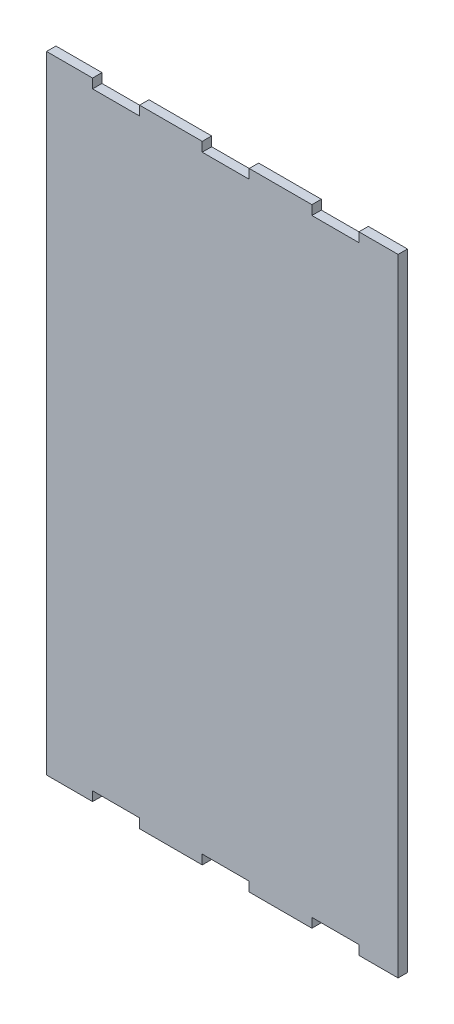
ISO-10303-21;
HEADER;
FILE_DESCRIPTION(('STEP AP214'),'2;1');
FILE_NAME('part.step','',(''),(''),'','','');
FILE_SCHEMA(('AUTOMOTIVE_DESIGN { 1 0 10303 214 1 1 1 1 }'));
ENDSEC;
DATA;
#1=APPLICATION_CONTEXT('core data for automotive mechanical design processes');
#2=APPLICATION_PROTOCOL_DEFINITION('international standard','automotive_design',2000,#1);
#3=PRODUCT_CONTEXT('',#1,'mechanical');
#4=PRODUCT('Part','Part','',(#3));
#5=PRODUCT_RELATED_PRODUCT_CATEGORY('part','',(#4));
#6=PRODUCT_DEFINITION_FORMATION('','',#4);
#7=PRODUCT_DEFINITION_CONTEXT('part definition',#1,'design');
#8=PRODUCT_DEFINITION('design','',#6,#7);
#9=PRODUCT_DEFINITION_SHAPE('','',#8);
#10=(LENGTH_UNIT() NAMED_UNIT(*) SI_UNIT(.MILLI.,.METRE.));
#11=(NAMED_UNIT(*) PLANE_ANGLE_UNIT() SI_UNIT($,.RADIAN.));
#12=(NAMED_UNIT(*) SI_UNIT($,.STERADIAN.) SOLID_ANGLE_UNIT());
#13=UNCERTAINTY_MEASURE_WITH_UNIT(LENGTH_MEASURE(1.E-05),#10,'distance_accuracy_value','');
#14=(GEOMETRIC_REPRESENTATION_CONTEXT(3) GLOBAL_UNCERTAINTY_ASSIGNED_CONTEXT((#13)) GLOBAL_UNIT_ASSIGNED_CONTEXT((#10,
#11,#12)) REPRESENTATION_CONTEXT('',''));
#15=CARTESIAN_POINT('',(0.,0.,0.));
#16=DIRECTION('',(0.,0.,1.));
#17=DIRECTION('',(1.,0.,0.));
#18=AXIS2_PLACEMENT_3D('',#15,#16,#17);
#19=CARTESIAN_POINT('',(0.,200.,3.));
#20=DIRECTION('',(0.,-1.,0.));
#21=DIRECTION('',(0.,0.,-1.));
#22=AXIS2_PLACEMENT_3D('',#19,#20,#21);
#23=PLANE('',#22);
#24=DIRECTION('',(0.,0.,1.));
#25=VECTOR('',#24,1.);
#26=CARTESIAN_POINT('',(82.5,200.,0.));
#27=LINE('',#26,#25);
#28=CARTESIAN_POINT('',(82.5,200.,0.));
#29=VERTEX_POINT('',#28);
#30=CARTESIAN_POINT('',(82.5,200.,3.));
#31=VERTEX_POINT('',#30);
#32=EDGE_CURVE('E271',#29,#31,#27,.T.);
#33=ORIENTED_EDGE('',*,*,#32,.F.);
#34=DIRECTION('',(-1.,0.,0.));
#35=VECTOR('',#34,1.);
#36=CARTESIAN_POINT('',(0.,200.,0.));
#37=LINE('',#36,#35);
#38=CARTESIAN_POINT('',(62.5,200.,0.));
#39=VERTEX_POINT('',#38);
#40=EDGE_CURVE('E421',#29,#39,#37,.T.);
#41=ORIENTED_EDGE('',*,*,#40,.T.);
#42=DIRECTION('',(0.,0.,1.));
#43=VECTOR('',#42,1.);
#44=CARTESIAN_POINT('',(62.5,200.,0.));
#45=LINE('',#44,#43);
#46=CARTESIAN_POINT('',(62.5,200.,3.));
#47=VERTEX_POINT('',#46);
#48=EDGE_CURVE('E323',#39,#47,#45,.T.);
#49=ORIENTED_EDGE('',*,*,#48,.T.);
#50=DIRECTION('',(-1.,0.,0.));
#51=VECTOR('',#50,1.);
#52=CARTESIAN_POINT('',(0.,200.,3.));
#53=LINE('',#52,#51);
#54=EDGE_CURVE('E417',#31,#47,#53,.T.);
#55=ORIENTED_EDGE('',*,*,#54,.F.);
#56=EDGE_LOOP('',(#33,#41,#49,#55));
#57=FACE_BOUND('',#56,.T.);
#58=ADVANCED_FACE('F39',(#57),#23,.F.);
#59=DIRECTION('',(0.,0.,1.));
#60=VECTOR('',#59,1.);
#61=CARTESIAN_POINT('',(97.5,200.,0.));
#62=LINE('',#61,#60);
#63=CARTESIAN_POINT('',(97.5,200.,0.));
#64=VERTEX_POINT('',#63);
#65=CARTESIAN_POINT('',(97.5,200.,3.));
#66=VERTEX_POINT('',#65);
#67=EDGE_CURVE('E299',#64,#66,#62,.T.);
#68=ORIENTED_EDGE('',*,*,#67,.T.);
#69=CARTESIAN_POINT('',(110.,200.,3.));
#70=VERTEX_POINT('',#69);
#71=EDGE_CURVE('E414',#70,#66,#53,.T.);
#72=ORIENTED_EDGE('',*,*,#71,.F.);
#73=DIRECTION('',(0.,0.,-1.));
#74=VECTOR('',#73,1.);
#75=CARTESIAN_POINT('',(110.,200.,3.));
#76=LINE('',#75,#74);
#77=CARTESIAN_POINT('',(110.,200.,0.));
#78=VERTEX_POINT('',#77);
#79=EDGE_CURVE('E47',#70,#78,#76,.T.);
#80=ORIENTED_EDGE('',*,*,#79,.T.);
#81=EDGE_CURVE('E238',#78,#64,#37,.T.);
#82=ORIENTED_EDGE('',*,*,#81,.T.);
#83=EDGE_LOOP('',(#68,#72,#80,#82));
#84=FACE_BOUND('',#83,.T.);
#85=ADVANCED_FACE('F427',(#84),#23,.F.);
#86=DIRECTION('',(0.,0.,1.));
#87=VECTOR('',#86,1.);
#88=CARTESIAN_POINT('',(12.5,200.,0.));
#89=LINE('',#88,#87);
#90=CARTESIAN_POINT('',(12.5,200.,0.));
#91=VERTEX_POINT('',#90);
#92=CARTESIAN_POINT('',(12.5,200.,3.));
#93=VERTEX_POINT('',#92);
#94=EDGE_CURVE('E231',#91,#93,#89,.T.);
#95=ORIENTED_EDGE('',*,*,#94,.F.);
#96=CARTESIAN_POINT('',(-2.2,200.000000000092,0.));
#97=VERTEX_POINT('',#96);
#98=EDGE_CURVE('E225',#91,#97,#37,.T.);
#99=ORIENTED_EDGE('',*,*,#98,.T.);
#100=DIRECTION('',(0.,0.,1.));
#101=VECTOR('',#100,1.);
#102=CARTESIAN_POINT('',(-2.2,200.000000000092,0.));
#103=LINE('',#102,#101);
#104=CARTESIAN_POINT('',(-2.2,200.000000000092,3.));
#105=VERTEX_POINT('',#104);
#106=EDGE_CURVE('E229',#97,#105,#103,.T.);
#107=ORIENTED_EDGE('',*,*,#106,.T.);
#108=EDGE_CURVE('E413',#93,#105,#53,.T.);
#109=ORIENTED_EDGE('',*,*,#108,.F.);
#110=EDGE_LOOP('',(#95,#99,#107,#109));
#111=FACE_BOUND('',#110,.T.);
#112=ADVANCED_FACE('F227',(#111),#23,.F.);
#113=DIRECTION('',(0.,0.,1.));
#114=VECTOR('',#113,1.);
#115=CARTESIAN_POINT('',(27.5,200.,0.));
#116=LINE('',#115,#114);
#117=CARTESIAN_POINT('',(27.5,200.,0.));
#118=VERTEX_POINT('',#117);
#119=CARTESIAN_POINT('',(27.5,200.,3.));
#120=VERTEX_POINT('',#119);
#121=EDGE_CURVE('E278',#118,#120,#116,.T.);
#122=ORIENTED_EDGE('',*,*,#121,.T.);
#123=CARTESIAN_POINT('',(47.5,200.,3.));
#124=VERTEX_POINT('',#123);
#125=EDGE_CURVE('E512',#124,#120,#53,.T.);
#126=ORIENTED_EDGE('',*,*,#125,.F.);
#127=DIRECTION('',(0.,0.,1.));
#128=VECTOR('',#127,1.);
#129=CARTESIAN_POINT('',(47.5,200.,0.));
#130=LINE('',#129,#128);
#131=CARTESIAN_POINT('',(47.5,200.,0.));
#132=VERTEX_POINT('',#131);
#133=EDGE_CURVE('E320',#132,#124,#130,.T.);
#134=ORIENTED_EDGE('',*,*,#133,.F.);
#135=EDGE_CURVE('E235',#132,#118,#37,.T.);
#136=ORIENTED_EDGE('',*,*,#135,.T.);
#137=EDGE_LOOP('',(#122,#126,#134,#136));
#138=FACE_BOUND('',#137,.T.);
#139=ADVANCED_FACE('F494',(#138),#23,.F.);
#140=CARTESIAN_POINT('',(0.,0.,3.));
#141=DIRECTION('',(0.,0.,-1.));
#142=DIRECTION('',(-1.,0.,0.));
#143=AXIS2_PLACEMENT_3D('',#140,#141,#142);
#144=PLANE('',#143);
#145=DIRECTION('',(0.,1.,0.));
#146=VECTOR('',#145,1.);
#147=CARTESIAN_POINT('',(82.5,197.,3.));
#148=LINE('',#147,#146);
#149=CARTESIAN_POINT('',(82.5,197.,3.));
#150=VERTEX_POINT('',#149);
#151=EDGE_CURVE('E257',#150,#31,#148,.T.);
#152=ORIENTED_EDGE('',*,*,#151,.T.);
#153=ORIENTED_EDGE('',*,*,#54,.T.);
#154=DIRECTION('',(0.,-1.,0.));
#155=VECTOR('',#154,1.);
#156=CARTESIAN_POINT('',(62.5,200.,3.));
#157=LINE('',#156,#155);
#158=CARTESIAN_POINT('',(62.5,197.,3.));
#159=VERTEX_POINT('',#158);
#160=EDGE_CURVE('E307',#47,#159,#157,.T.);
#161=ORIENTED_EDGE('',*,*,#160,.T.);
#162=DIRECTION('',(-1.,0.,0.));
#163=VECTOR('',#162,1.);
#164=CARTESIAN_POINT('',(47.5,197.,3.));
#165=LINE('',#164,#163);
#166=CARTESIAN_POINT('',(47.5,197.,3.));
#167=VERTEX_POINT('',#166);
#168=EDGE_CURVE('E315',#159,#167,#165,.T.);
#169=ORIENTED_EDGE('',*,*,#168,.T.);
#170=DIRECTION('',(0.,1.,0.));
#171=VECTOR('',#170,1.);
#172=CARTESIAN_POINT('',(47.5,200.,3.));
#173=LINE('',#172,#171);
#174=EDGE_CURVE('E277',#167,#124,#173,.T.);
#175=ORIENTED_EDGE('',*,*,#174,.T.);
#176=ORIENTED_EDGE('',*,*,#125,.T.);
#177=DIRECTION('',(0.,-1.,0.));
#178=VECTOR('',#177,1.);
#179=CARTESIAN_POINT('',(27.5,200.,3.));
#180=LINE('',#179,#178);
#181=CARTESIAN_POINT('',(27.5,197.,3.));
#182=VERTEX_POINT('',#181);
#183=EDGE_CURVE('E262',#120,#182,#180,.T.);
#184=ORIENTED_EDGE('',*,*,#183,.T.);
#185=DIRECTION('',(-1.,0.,0.));
#186=VECTOR('',#185,1.);
#187=CARTESIAN_POINT('',(12.5,197.,3.));
#188=LINE('',#187,#186);
#189=CARTESIAN_POINT('',(12.5,197.,3.));
#190=VERTEX_POINT('',#189);
#191=EDGE_CURVE('E270',#182,#190,#188,.T.);
#192=ORIENTED_EDGE('',*,*,#191,.T.);
#193=DIRECTION('',(0.,1.,0.));
#194=VECTOR('',#193,1.);
#195=CARTESIAN_POINT('',(12.5,200.,3.));
#196=LINE('',#195,#194);
#197=EDGE_CURVE('E267',#190,#93,#196,.T.);
#198=ORIENTED_EDGE('',*,*,#197,.T.);
#199=ORIENTED_EDGE('',*,*,#108,.T.);
#200=DIRECTION('',(0.,-1.,0.));
#201=VECTOR('',#200,1.);
#202=CARTESIAN_POINT('',(-2.2,200.000000000092,3.));
#203=LINE('',#202,#201);
#204=CARTESIAN_POINT('',(-2.2,0.,3.));
#205=VERTEX_POINT('',#204);
#206=EDGE_CURVE('E245',#105,#205,#203,.T.);
#207=ORIENTED_EDGE('',*,*,#206,.T.);
#208=DIRECTION('',(1.,0.,0.));
#209=VECTOR('',#208,1.);
#210=CARTESIAN_POINT('',(0.,0.,3.));
#211=LINE('',#210,#209);
#212=CARTESIAN_POINT('',(12.5,0.,3.));
#213=VERTEX_POINT('',#212);
#214=EDGE_CURVE('E406',#205,#213,#211,.T.);
#215=ORIENTED_EDGE('',*,*,#214,.T.);
#216=DIRECTION('',(0.,-1.,0.));
#217=VECTOR('',#216,1.);
#218=CARTESIAN_POINT('',(12.5,0.,3.));
#219=LINE('',#218,#217);
#220=CARTESIAN_POINT('',(12.5,3.,3.));
#221=VERTEX_POINT('',#220);
#222=EDGE_CURVE('E339',#221,#213,#219,.T.);
#223=ORIENTED_EDGE('',*,*,#222,.F.);
#224=DIRECTION('',(-1.,0.,0.));
#225=VECTOR('',#224,1.);
#226=CARTESIAN_POINT('',(12.5,3.,3.));
#227=LINE('',#226,#225);
#228=CARTESIAN_POINT('',(27.5,3.,3.));
#229=VERTEX_POINT('',#228);
#230=EDGE_CURVE('E332',#229,#221,#227,.T.);
#231=ORIENTED_EDGE('',*,*,#230,.F.);
#232=DIRECTION('',(0.,1.,0.));
#233=VECTOR('',#232,1.);
#234=CARTESIAN_POINT('',(27.5,0.,3.));
#235=LINE('',#234,#233);
#236=CARTESIAN_POINT('',(27.5,0.,3.));
#237=VERTEX_POINT('',#236);
#238=EDGE_CURVE('E341',#237,#229,#235,.T.);
#239=ORIENTED_EDGE('',*,*,#238,.F.);
#240=CARTESIAN_POINT('',(47.5,0.,3.));
#241=VERTEX_POINT('',#240);
#242=EDGE_CURVE('E410',#237,#241,#211,.T.);
#243=ORIENTED_EDGE('',*,*,#242,.T.);
#244=DIRECTION('',(0.,-1.,0.));
#245=VECTOR('',#244,1.);
#246=CARTESIAN_POINT('',(47.5,0.,3.));
#247=LINE('',#246,#245);
#248=CARTESIAN_POINT('',(47.5,3.,3.));
#249=VERTEX_POINT('',#248);
#250=EDGE_CURVE('E349',#249,#241,#247,.T.);
#251=ORIENTED_EDGE('',*,*,#250,.F.);
#252=DIRECTION('',(-1.,0.,0.));
#253=VECTOR('',#252,1.);
#254=CARTESIAN_POINT('',(47.5,3.,3.));
#255=LINE('',#254,#253);
#256=CARTESIAN_POINT('',(62.5,3.,3.));
#257=VERTEX_POINT('',#256);
#258=EDGE_CURVE('E384',#257,#249,#255,.T.);
#259=ORIENTED_EDGE('',*,*,#258,.F.);
#260=DIRECTION('',(0.,1.,0.));
#261=VECTOR('',#260,1.);
#262=CARTESIAN_POINT('',(62.5,0.,3.));
#263=LINE('',#262,#261);
#264=CARTESIAN_POINT('',(62.5,0.,3.));
#265=VERTEX_POINT('',#264);
#266=EDGE_CURVE('E392',#265,#257,#263,.T.);
#267=ORIENTED_EDGE('',*,*,#266,.F.);
#268=CARTESIAN_POINT('',(82.5,0.,3.));
#269=VERTEX_POINT('',#268);
#270=EDGE_CURVE('E465',#265,#269,#211,.T.);
#271=ORIENTED_EDGE('',*,*,#270,.T.);
#272=DIRECTION('',(0.,-1.,0.));
#273=VECTOR('',#272,1.);
#274=CARTESIAN_POINT('',(82.5,3.,3.));
#275=LINE('',#274,#273);
#276=CARTESIAN_POINT('',(82.5,3.,3.));
#277=VERTEX_POINT('',#276);
#278=EDGE_CURVE('E322',#277,#269,#275,.T.);
#279=ORIENTED_EDGE('',*,*,#278,.F.);
#280=DIRECTION('',(-1.,0.,0.));
#281=VECTOR('',#280,1.);
#282=CARTESIAN_POINT('',(82.5,3.,3.));
#283=LINE('',#282,#281);
#284=CARTESIAN_POINT('',(97.5,3.,3.));
#285=VERTEX_POINT('',#284);
#286=EDGE_CURVE('E360',#285,#277,#283,.T.);
#287=ORIENTED_EDGE('',*,*,#286,.F.);
#288=DIRECTION('',(0.,1.,0.));
#289=VECTOR('',#288,1.);
#290=CARTESIAN_POINT('',(97.5,3.,3.));
#291=LINE('',#290,#289);
#292=CARTESIAN_POINT('',(97.5,0.,3.));
#293=VERTEX_POINT('',#292);
#294=EDGE_CURVE('E368',#293,#285,#291,.T.);
#295=ORIENTED_EDGE('',*,*,#294,.F.);
#296=CARTESIAN_POINT('',(110.,0.,3.));
#297=VERTEX_POINT('',#296);
#298=EDGE_CURVE('E411',#293,#297,#211,.T.);
#299=ORIENTED_EDGE('',*,*,#298,.T.);
#300=DIRECTION('',(0.,1.,0.));
#301=VECTOR('',#300,1.);
#302=CARTESIAN_POINT('',(110.,0.,3.));
#303=LINE('',#302,#301);
#304=EDGE_CURVE('E409',#297,#70,#303,.T.);
#305=ORIENTED_EDGE('',*,*,#304,.T.);
#306=ORIENTED_EDGE('',*,*,#71,.T.);
#307=DIRECTION('',(0.,-1.,0.));
#308=VECTOR('',#307,1.);
#309=CARTESIAN_POINT('',(97.5,197.,3.));
#310=LINE('',#309,#308);
#311=CARTESIAN_POINT('',(97.5,197.,3.));
#312=VERTEX_POINT('',#311);
#313=EDGE_CURVE('E286',#66,#312,#310,.T.);
#314=ORIENTED_EDGE('',*,*,#313,.T.);
#315=DIRECTION('',(-1.,0.,0.));
#316=VECTOR('',#315,1.);
#317=CARTESIAN_POINT('',(82.5,197.,3.));
#318=LINE('',#317,#316);
#319=EDGE_CURVE('E293',#312,#150,#318,.T.);
#320=ORIENTED_EDGE('',*,*,#319,.T.);
#321=EDGE_LOOP('',(#152,#153,#161,#169,#175,#176,#184,#192,#198,#199,#207,#215,#223,#231,#239,
#243,#251,#259,#267,#271,#279,#287,#295,#299,#305,#306,#314,#320));
#322=FACE_BOUND('',#321,.T.);
#323=ADVANCED_FACE('F438',(#322),#144,.F.);
#324=CARTESIAN_POINT('',(0.,0.,0.));
#325=DIRECTION('',(0.,0.,-1.));
#326=DIRECTION('',(-1.,0.,0.));
#327=AXIS2_PLACEMENT_3D('',#324,#325,#326);
#328=PLANE('',#327);
#329=ORIENTED_EDGE('',*,*,#40,.F.);
#330=DIRECTION('',(0.,1.,0.));
#331=VECTOR('',#330,1.);
#332=CARTESIAN_POINT('',(82.5,197.,0.));
#333=LINE('',#332,#331);
#334=CARTESIAN_POINT('',(82.5,197.,0.));
#335=VERTEX_POINT('',#334);
#336=EDGE_CURVE('E283',#335,#29,#333,.T.);
#337=ORIENTED_EDGE('',*,*,#336,.F.);
#338=DIRECTION('',(-1.,0.,0.));
#339=VECTOR('',#338,1.);
#340=CARTESIAN_POINT('',(82.5,197.,0.));
#341=LINE('',#340,#339);
#342=CARTESIAN_POINT('',(97.5,197.,0.));
#343=VERTEX_POINT('',#342);
#344=EDGE_CURVE('E285',#343,#335,#341,.T.);
#345=ORIENTED_EDGE('',*,*,#344,.F.);
#346=DIRECTION('',(0.,-1.,0.));
#347=VECTOR('',#346,1.);
#348=CARTESIAN_POINT('',(97.5,197.,0.));
#349=LINE('',#348,#347);
#350=EDGE_CURVE('E288',#64,#343,#349,.T.);
#351=ORIENTED_EDGE('',*,*,#350,.F.);
#352=ORIENTED_EDGE('',*,*,#81,.F.);
#353=DIRECTION('',(0.,1.,0.));
#354=VECTOR('',#353,1.);
#355=CARTESIAN_POINT('',(110.,0.,0.));
#356=LINE('',#355,#354);
#357=CARTESIAN_POINT('',(110.,0.,0.));
#358=VERTEX_POINT('',#357);
#359=EDGE_CURVE('E236',#358,#78,#356,.T.);
#360=ORIENTED_EDGE('',*,*,#359,.F.);
#361=DIRECTION('',(1.,0.,0.));
#362=VECTOR('',#361,1.);
#363=CARTESIAN_POINT('',(0.,0.,0.));
#364=LINE('',#363,#362);
#365=CARTESIAN_POINT('',(97.5,0.,0.));
#366=VERTEX_POINT('',#365);
#367=EDGE_CURVE('E399',#366,#358,#364,.T.);
#368=ORIENTED_EDGE('',*,*,#367,.F.);
#369=DIRECTION('',(0.,1.,0.));
#370=VECTOR('',#369,1.);
#371=CARTESIAN_POINT('',(97.5,3.,0.));
#372=LINE('',#371,#370);
#373=CARTESIAN_POINT('',(97.5,3.,0.));
#374=VERTEX_POINT('',#373);
#375=EDGE_CURVE('E359',#366,#374,#372,.T.);
#376=ORIENTED_EDGE('',*,*,#375,.T.);
#377=DIRECTION('',(-1.,0.,0.));
#378=VECTOR('',#377,1.);
#379=CARTESIAN_POINT('',(82.5,3.,0.));
#380=LINE('',#379,#378);
#381=CARTESIAN_POINT('',(82.5,3.,0.));
#382=VERTEX_POINT('',#381);
#383=EDGE_CURVE('E363',#374,#382,#380,.T.);
#384=ORIENTED_EDGE('',*,*,#383,.T.);
#385=DIRECTION('',(0.,-1.,0.));
#386=VECTOR('',#385,1.);
#387=CARTESIAN_POINT('',(82.5,3.,0.));
#388=LINE('',#387,#386);
#389=CARTESIAN_POINT('',(82.5,0.,0.));
#390=VERTEX_POINT('',#389);
#391=EDGE_CURVE('E356',#382,#390,#388,.T.);
#392=ORIENTED_EDGE('',*,*,#391,.T.);
#393=CARTESIAN_POINT('',(62.5,0.,0.));
#394=VERTEX_POINT('',#393);
#395=EDGE_CURVE('E445',#394,#390,#364,.T.);
#396=ORIENTED_EDGE('',*,*,#395,.F.);
#397=DIRECTION('',(0.,1.,0.));
#398=VECTOR('',#397,1.);
#399=CARTESIAN_POINT('',(62.5,0.,0.));
#400=LINE('',#399,#398);
#401=CARTESIAN_POINT('',(62.5,3.,0.));
#402=VERTEX_POINT('',#401);
#403=EDGE_CURVE('E383',#394,#402,#400,.T.);
#404=ORIENTED_EDGE('',*,*,#403,.T.);
#405=DIRECTION('',(-1.,0.,0.));
#406=VECTOR('',#405,1.);
#407=CARTESIAN_POINT('',(47.5,3.,0.));
#408=LINE('',#407,#406);
#409=CARTESIAN_POINT('',(47.5,3.,0.));
#410=VERTEX_POINT('',#409);
#411=EDGE_CURVE('E387',#402,#410,#408,.T.);
#412=ORIENTED_EDGE('',*,*,#411,.T.);
#413=DIRECTION('',(0.,-1.,0.));
#414=VECTOR('',#413,1.);
#415=CARTESIAN_POINT('',(47.5,0.,0.));
#416=LINE('',#415,#414);
#417=CARTESIAN_POINT('',(47.5,0.,0.));
#418=VERTEX_POINT('',#417);
#419=EDGE_CURVE('E380',#410,#418,#416,.T.);
#420=ORIENTED_EDGE('',*,*,#419,.T.);
#421=CARTESIAN_POINT('',(27.5,0.,0.));
#422=VERTEX_POINT('',#421);
#423=EDGE_CURVE('E419',#422,#418,#364,.T.);
#424=ORIENTED_EDGE('',*,*,#423,.F.);
#425=DIRECTION('',(0.,1.,0.));
#426=VECTOR('',#425,1.);
#427=CARTESIAN_POINT('',(27.5,0.,0.));
#428=LINE('',#427,#426);
#429=CARTESIAN_POINT('',(27.5,3.,0.));
#430=VERTEX_POINT('',#429);
#431=EDGE_CURVE('E331',#422,#430,#428,.T.);
#432=ORIENTED_EDGE('',*,*,#431,.T.);
#433=DIRECTION('',(-1.,0.,0.));
#434=VECTOR('',#433,1.);
#435=CARTESIAN_POINT('',(12.5,3.,0.));
#436=LINE('',#435,#434);
#437=CARTESIAN_POINT('',(12.5,3.,0.));
#438=VERTEX_POINT('',#437);
#439=EDGE_CURVE('E335',#430,#438,#436,.T.);
#440=ORIENTED_EDGE('',*,*,#439,.T.);
#441=DIRECTION('',(0.,-1.,0.));
#442=VECTOR('',#441,1.);
#443=CARTESIAN_POINT('',(12.5,0.,0.));
#444=LINE('',#443,#442);
#445=CARTESIAN_POINT('',(12.5,0.,0.));
#446=VERTEX_POINT('',#445);
#447=EDGE_CURVE('E329',#438,#446,#444,.T.);
#448=ORIENTED_EDGE('',*,*,#447,.T.);
#449=CARTESIAN_POINT('',(-2.2,0.,0.));
#450=VERTEX_POINT('',#449);
#451=EDGE_CURVE('E252',#450,#446,#364,.T.);
#452=ORIENTED_EDGE('',*,*,#451,.F.);
#453=DIRECTION('',(0.,-1.,0.));
#454=VECTOR('',#453,1.);
#455=CARTESIAN_POINT('',(-2.2,200.000000000092,0.));
#456=LINE('',#455,#454);
#457=EDGE_CURVE('E243',#97,#450,#456,.T.);
#458=ORIENTED_EDGE('',*,*,#457,.F.);
#459=ORIENTED_EDGE('',*,*,#98,.F.);
#460=DIRECTION('',(0.,1.,0.));
#461=VECTOR('',#460,1.);
#462=CARTESIAN_POINT('',(12.5,200.,0.));
#463=LINE('',#462,#461);
#464=CARTESIAN_POINT('',(12.5,197.,0.));
#465=VERTEX_POINT('',#464);
#466=EDGE_CURVE('E259',#465,#91,#463,.T.);
#467=ORIENTED_EDGE('',*,*,#466,.F.);
#468=DIRECTION('',(-1.,0.,0.));
#469=VECTOR('',#468,1.);
#470=CARTESIAN_POINT('',(12.5,197.,0.));
#471=LINE('',#470,#469);
#472=CARTESIAN_POINT('',(27.5,197.,0.));
#473=VERTEX_POINT('',#472);
#474=EDGE_CURVE('E261',#473,#465,#471,.T.);
#475=ORIENTED_EDGE('',*,*,#474,.F.);
#476=DIRECTION('',(0.,-1.,0.));
#477=VECTOR('',#476,1.);
#478=CARTESIAN_POINT('',(27.5,200.,0.));
#479=LINE('',#478,#477);
#480=EDGE_CURVE('E264',#118,#473,#479,.T.);
#481=ORIENTED_EDGE('',*,*,#480,.F.);
#482=ORIENTED_EDGE('',*,*,#135,.F.);
#483=DIRECTION('',(0.,1.,0.));
#484=VECTOR('',#483,1.);
#485=CARTESIAN_POINT('',(47.5,200.,0.));
#486=LINE('',#485,#484);
#487=CARTESIAN_POINT('',(47.5,197.,0.));
#488=VERTEX_POINT('',#487);
#489=EDGE_CURVE('E304',#488,#132,#486,.T.);
#490=ORIENTED_EDGE('',*,*,#489,.F.);
#491=DIRECTION('',(-1.,0.,0.));
#492=VECTOR('',#491,1.);
#493=CARTESIAN_POINT('',(47.5,197.,0.));
#494=LINE('',#493,#492);
#495=CARTESIAN_POINT('',(62.5,197.,0.));
#496=VERTEX_POINT('',#495);
#497=EDGE_CURVE('E306',#496,#488,#494,.T.);
#498=ORIENTED_EDGE('',*,*,#497,.F.);
#499=DIRECTION('',(0.,-1.,0.));
#500=VECTOR('',#499,1.);
#501=CARTESIAN_POINT('',(62.5,200.,0.));
#502=LINE('',#501,#500);
#503=EDGE_CURVE('E309',#39,#496,#502,.T.);
#504=ORIENTED_EDGE('',*,*,#503,.F.);
#505=EDGE_LOOP('',(#329,#337,#345,#351,#352,#360,#368,#376,#384,#392,#396,#404,#412,#420,#424,
#432,#440,#448,#452,#458,#459,#467,#475,#481,#482,#490,#498,#504));
#506=FACE_BOUND('',#505,.T.);
#507=ADVANCED_FACE('F249',(#506),#328,.T.);
#508=CARTESIAN_POINT('',(0.,0.,3.));
#509=DIRECTION('',(0.,1.,0.));
#510=DIRECTION('',(0.,0.,1.));
#511=AXIS2_PLACEMENT_3D('',#508,#509,#510);
#512=PLANE('',#511);
#513=ORIENTED_EDGE('',*,*,#395,.T.);
#514=DIRECTION('',(0.,0.,1.));
#515=VECTOR('',#514,1.);
#516=CARTESIAN_POINT('',(82.5,0.,0.));
#517=LINE('',#516,#515);
#518=EDGE_CURVE('E366',#390,#269,#517,.T.);
#519=ORIENTED_EDGE('',*,*,#518,.T.);
#520=ORIENTED_EDGE('',*,*,#270,.F.);
#521=DIRECTION('',(0.,0.,1.));
#522=VECTOR('',#521,1.);
#523=CARTESIAN_POINT('',(62.5,0.,0.));
#524=LINE('',#523,#522);
#525=EDGE_CURVE('E402',#394,#265,#524,.T.);
#526=ORIENTED_EDGE('',*,*,#525,.F.);
#527=EDGE_LOOP('',(#513,#519,#520,#526));
#528=FACE_BOUND('',#527,.T.);
#529=ADVANCED_FACE('F470',(#528),#512,.F.);
#530=ORIENTED_EDGE('',*,*,#451,.T.);
#531=DIRECTION('',(0.,0.,1.));
#532=VECTOR('',#531,1.);
#533=CARTESIAN_POINT('',(12.5,0.,0.));
#534=LINE('',#533,#532);
#535=EDGE_CURVE('E338',#446,#213,#534,.T.);
#536=ORIENTED_EDGE('',*,*,#535,.T.);
#537=ORIENTED_EDGE('',*,*,#214,.F.);
#538=DIRECTION('',(0.,0.,1.));
#539=VECTOR('',#538,1.);
#540=CARTESIAN_POINT('',(-2.2,0.,0.));
#541=LINE('',#540,#539);
#542=EDGE_CURVE('E246',#450,#205,#541,.T.);
#543=ORIENTED_EDGE('',*,*,#542,.F.);
#544=EDGE_LOOP('',(#530,#536,#537,#543));
#545=FACE_BOUND('',#544,.T.);
#546=ADVANCED_FACE('F572',(#545),#512,.F.);
#547=ORIENTED_EDGE('',*,*,#242,.F.);
#548=DIRECTION('',(0.,0.,1.));
#549=VECTOR('',#548,1.);
#550=CARTESIAN_POINT('',(27.5,0.,0.));
#551=LINE('',#550,#549);
#552=EDGE_CURVE('E352',#422,#237,#551,.T.);
#553=ORIENTED_EDGE('',*,*,#552,.F.);
#554=ORIENTED_EDGE('',*,*,#423,.T.);
#555=DIRECTION('',(0.,0.,1.));
#556=VECTOR('',#555,1.);
#557=CARTESIAN_POINT('',(47.5,0.,0.));
#558=LINE('',#557,#556);
#559=EDGE_CURVE('E390',#418,#241,#558,.T.);
#560=ORIENTED_EDGE('',*,*,#559,.T.);
#561=EDGE_LOOP('',(#547,#553,#554,#560));
#562=FACE_BOUND('',#561,.T.);
#563=ADVANCED_FACE('F455',(#562),#512,.F.);
#564=ORIENTED_EDGE('',*,*,#298,.F.);
#565=DIRECTION('',(0.,0.,1.));
#566=VECTOR('',#565,1.);
#567=CARTESIAN_POINT('',(97.5,0.,0.));
#568=LINE('',#567,#566);
#569=EDGE_CURVE('E376',#366,#293,#568,.T.);
#570=ORIENTED_EDGE('',*,*,#569,.F.);
#571=ORIENTED_EDGE('',*,*,#367,.T.);
#572=DIRECTION('',(0.,0.,-1.));
#573=VECTOR('',#572,1.);
#574=CARTESIAN_POINT('',(110.,0.,3.));
#575=LINE('',#574,#573);
#576=EDGE_CURVE('E11',#297,#358,#575,.T.);
#577=ORIENTED_EDGE('',*,*,#576,.F.);
#578=EDGE_LOOP('',(#564,#570,#571,#577));
#579=FACE_BOUND('',#578,.T.);
#580=ADVANCED_FACE('F41',(#579),#512,.F.);
#581=CARTESIAN_POINT('',(110.,0.,3.));
#582=DIRECTION('',(-1.,0.,0.));
#583=DIRECTION('',(0.,0.,1.));
#584=AXIS2_PLACEMENT_3D('',#581,#582,#583);
#585=PLANE('',#584);
#586=ORIENTED_EDGE('',*,*,#359,.T.);
#587=ORIENTED_EDGE('',*,*,#79,.F.);
#588=ORIENTED_EDGE('',*,*,#304,.F.);
#589=ORIENTED_EDGE('',*,*,#576,.T.);
#590=EDGE_LOOP('',(#586,#587,#588,#589));
#591=FACE_BOUND('',#590,.T.);
#592=ADVANCED_FACE('F442',(#591),#585,.F.);
#593=CARTESIAN_POINT('',(47.5,0.,0.));
#594=DIRECTION('',(-1.,0.,0.));
#595=DIRECTION('',(0.,0.,1.));
#596=AXIS2_PLACEMENT_3D('',#593,#594,#595);
#597=PLANE('',#596);
#598=ORIENTED_EDGE('',*,*,#250,.T.);
#599=ORIENTED_EDGE('',*,*,#559,.F.);
#600=ORIENTED_EDGE('',*,*,#419,.F.);
#601=DIRECTION('',(0.,0.,1.));
#602=VECTOR('',#601,1.);
#603=CARTESIAN_POINT('',(47.5,3.,0.));
#604=LINE('',#603,#602);
#605=EDGE_CURVE('E397',#410,#249,#604,.T.);
#606=ORIENTED_EDGE('',*,*,#605,.T.);
#607=EDGE_LOOP('',(#598,#599,#600,#606));
#608=FACE_BOUND('',#607,.T.);
#609=ADVANCED_FACE('F459',(#608),#597,.F.);
#610=CARTESIAN_POINT('',(47.5,3.,0.));
#611=DIRECTION('',(0.,1.,0.));
#612=DIRECTION('',(-1.,0.,0.));
#613=AXIS2_PLACEMENT_3D('',#610,#611,#612);
#614=PLANE('',#613);
#615=ORIENTED_EDGE('',*,*,#258,.T.);
#616=ORIENTED_EDGE('',*,*,#605,.F.);
#617=ORIENTED_EDGE('',*,*,#411,.F.);
#618=DIRECTION('',(0.,0.,1.));
#619=VECTOR('',#618,1.);
#620=CARTESIAN_POINT('',(62.5,3.,0.));
#621=LINE('',#620,#619);
#622=EDGE_CURVE('E400',#402,#257,#621,.T.);
#623=ORIENTED_EDGE('',*,*,#622,.T.);
#624=EDGE_LOOP('',(#615,#616,#617,#623));
#625=FACE_BOUND('',#624,.T.);
#626=ADVANCED_FACE('F566',(#625),#614,.F.);
#627=CARTESIAN_POINT('',(62.5,0.,0.));
#628=DIRECTION('',(1.,0.,0.));
#629=DIRECTION('',(0.,0.,-1.));
#630=AXIS2_PLACEMENT_3D('',#627,#628,#629);
#631=PLANE('',#630);
#632=ORIENTED_EDGE('',*,*,#266,.T.);
#633=ORIENTED_EDGE('',*,*,#622,.F.);
#634=ORIENTED_EDGE('',*,*,#403,.F.);
#635=ORIENTED_EDGE('',*,*,#525,.T.);
#636=EDGE_LOOP('',(#632,#633,#634,#635));
#637=FACE_BOUND('',#636,.T.);
#638=ADVANCED_FACE('F561',(#637),#631,.F.);
#639=CARTESIAN_POINT('',(12.5,0.,0.));
#640=DIRECTION('',(-1.,0.,0.));
#641=DIRECTION('',(0.,0.,1.));
#642=AXIS2_PLACEMENT_3D('',#639,#640,#641);
#643=PLANE('',#642);
#644=ORIENTED_EDGE('',*,*,#222,.T.);
#645=ORIENTED_EDGE('',*,*,#535,.F.);
#646=ORIENTED_EDGE('',*,*,#447,.F.);
#647=DIRECTION('',(0.,0.,1.));
#648=VECTOR('',#647,1.);
#649=CARTESIAN_POINT('',(12.5,3.,0.));
#650=LINE('',#649,#648);
#651=EDGE_CURVE('E347',#438,#221,#650,.T.);
#652=ORIENTED_EDGE('',*,*,#651,.T.);
#653=EDGE_LOOP('',(#644,#645,#646,#652));
#654=FACE_BOUND('',#653,.T.);
#655=ADVANCED_FACE('F555',(#654),#643,.F.);
#656=CARTESIAN_POINT('',(12.5,3.,0.));
#657=DIRECTION('',(0.,1.,0.));
#658=DIRECTION('',(0.,0.,1.));
#659=AXIS2_PLACEMENT_3D('',#656,#657,#658);
#660=PLANE('',#659);
#661=ORIENTED_EDGE('',*,*,#230,.T.);
#662=ORIENTED_EDGE('',*,*,#651,.F.);
#663=ORIENTED_EDGE('',*,*,#439,.F.);
#664=DIRECTION('',(0.,0.,1.));
#665=VECTOR('',#664,1.);
#666=CARTESIAN_POINT('',(27.5,3.,0.));
#667=LINE('',#666,#665);
#668=EDGE_CURVE('E350',#430,#229,#667,.T.);
#669=ORIENTED_EDGE('',*,*,#668,.T.);
#670=EDGE_LOOP('',(#661,#662,#663,#669));
#671=FACE_BOUND('',#670,.T.);
#672=ADVANCED_FACE('F551',(#671),#660,.F.);
#673=CARTESIAN_POINT('',(27.5,0.,0.));
#674=DIRECTION('',(1.,0.,0.));
#675=DIRECTION('',(0.,0.,-1.));
#676=AXIS2_PLACEMENT_3D('',#673,#674,#675);
#677=PLANE('',#676);
#678=ORIENTED_EDGE('',*,*,#238,.T.);
#679=ORIENTED_EDGE('',*,*,#668,.F.);
#680=ORIENTED_EDGE('',*,*,#431,.F.);
#681=ORIENTED_EDGE('',*,*,#552,.T.);
#682=EDGE_LOOP('',(#678,#679,#680,#681));
#683=FACE_BOUND('',#682,.T.);
#684=ADVANCED_FACE('F554',(#683),#677,.F.);
#685=CARTESIAN_POINT('',(82.5,3.,0.));
#686=DIRECTION('',(-1.,0.,0.));
#687=DIRECTION('',(0.,0.,1.));
#688=AXIS2_PLACEMENT_3D('',#685,#686,#687);
#689=PLANE('',#688);
#690=ORIENTED_EDGE('',*,*,#278,.T.);
#691=ORIENTED_EDGE('',*,*,#518,.F.);
#692=ORIENTED_EDGE('',*,*,#391,.F.);
#693=DIRECTION('',(0.,0.,1.));
#694=VECTOR('',#693,1.);
#695=CARTESIAN_POINT('',(82.5,3.,0.));
#696=LINE('',#695,#694);
#697=EDGE_CURVE('E342',#382,#277,#696,.T.);
#698=ORIENTED_EDGE('',*,*,#697,.T.);
#699=EDGE_LOOP('',(#690,#691,#692,#698));
#700=FACE_BOUND('',#699,.T.);
#701=ADVANCED_FACE('F473',(#700),#689,.F.);
#702=CARTESIAN_POINT('',(82.5,3.,0.));
#703=DIRECTION('',(0.,1.,0.));
#704=DIRECTION('',(-1.,0.,0.));
#705=AXIS2_PLACEMENT_3D('',#702,#703,#704);
#706=PLANE('',#705);
#707=ORIENTED_EDGE('',*,*,#286,.T.);
#708=ORIENTED_EDGE('',*,*,#697,.F.);
#709=ORIENTED_EDGE('',*,*,#383,.F.);
#710=DIRECTION('',(0.,0.,1.));
#711=VECTOR('',#710,1.);
#712=CARTESIAN_POINT('',(97.5,3.,0.));
#713=LINE('',#712,#711);
#714=EDGE_CURVE('E374',#374,#285,#713,.T.);
#715=ORIENTED_EDGE('',*,*,#714,.T.);
#716=EDGE_LOOP('',(#707,#708,#709,#715));
#717=FACE_BOUND('',#716,.T.);
#718=ADVANCED_FACE('F476',(#717),#706,.F.);
#719=CARTESIAN_POINT('',(97.5,3.,0.));
#720=DIRECTION('',(1.,0.,0.));
#721=DIRECTION('',(0.,0.,-1.));
#722=AXIS2_PLACEMENT_3D('',#719,#720,#721);
#723=PLANE('',#722);
#724=ORIENTED_EDGE('',*,*,#294,.T.);
#725=ORIENTED_EDGE('',*,*,#714,.F.);
#726=ORIENTED_EDGE('',*,*,#375,.F.);
#727=ORIENTED_EDGE('',*,*,#569,.T.);
#728=EDGE_LOOP('',(#724,#725,#726,#727));
#729=FACE_BOUND('',#728,.T.);
#730=ADVANCED_FACE('F478',(#729),#723,.F.);
#731=CARTESIAN_POINT('',(47.5,200.,0.));
#732=DIRECTION('',(1.,0.,0.));
#733=DIRECTION('',(0.,0.,-1.));
#734=AXIS2_PLACEMENT_3D('',#731,#732,#733);
#735=PLANE('',#734);
#736=ORIENTED_EDGE('',*,*,#174,.F.);
#737=DIRECTION('',(0.,0.,1.));
#738=VECTOR('',#737,1.);
#739=CARTESIAN_POINT('',(47.5,197.,0.));
#740=LINE('',#739,#738);
#741=EDGE_CURVE('E312',#488,#167,#740,.T.);
#742=ORIENTED_EDGE('',*,*,#741,.F.);
#743=ORIENTED_EDGE('',*,*,#489,.T.);
#744=ORIENTED_EDGE('',*,*,#133,.T.);
#745=EDGE_LOOP('',(#736,#742,#743,#744));
#746=FACE_BOUND('',#745,.T.);
#747=ADVANCED_FACE('F480',(#746),#735,.T.);
#748=CARTESIAN_POINT('',(62.5,200.,0.));
#749=DIRECTION('',(-1.,0.,0.));
#750=DIRECTION('',(0.,0.,1.));
#751=AXIS2_PLACEMENT_3D('',#748,#749,#750);
#752=PLANE('',#751);
#753=ORIENTED_EDGE('',*,*,#160,.F.);
#754=ORIENTED_EDGE('',*,*,#48,.F.);
#755=ORIENTED_EDGE('',*,*,#503,.T.);
#756=DIRECTION('',(0.,0.,1.));
#757=VECTOR('',#756,1.);
#758=CARTESIAN_POINT('',(62.5,197.,0.));
#759=LINE('',#758,#757);
#760=EDGE_CURVE('E326',#496,#159,#759,.T.);
#761=ORIENTED_EDGE('',*,*,#760,.T.);
#762=EDGE_LOOP('',(#753,#754,#755,#761));
#763=FACE_BOUND('',#762,.T.);
#764=ADVANCED_FACE('F486',(#763),#752,.T.);
#765=CARTESIAN_POINT('',(47.5,197.,0.));
#766=DIRECTION('',(0.,1.,0.));
#767=DIRECTION('',(-1.,0.,0.));
#768=AXIS2_PLACEMENT_3D('',#765,#766,#767);
#769=PLANE('',#768);
#770=ORIENTED_EDGE('',*,*,#168,.F.);
#771=ORIENTED_EDGE('',*,*,#760,.F.);
#772=ORIENTED_EDGE('',*,*,#497,.T.);
#773=ORIENTED_EDGE('',*,*,#741,.T.);
#774=EDGE_LOOP('',(#770,#771,#772,#773));
#775=FACE_BOUND('',#774,.T.);
#776=ADVANCED_FACE('F539',(#775),#769,.T.);
#777=CARTESIAN_POINT('',(12.5,200.,0.));
#778=DIRECTION('',(1.,0.,0.));
#779=DIRECTION('',(0.,0.,-1.));
#780=AXIS2_PLACEMENT_3D('',#777,#778,#779);
#781=PLANE('',#780);
#782=ORIENTED_EDGE('',*,*,#197,.F.);
#783=DIRECTION('',(0.,0.,1.));
#784=VECTOR('',#783,1.);
#785=CARTESIAN_POINT('',(12.5,197.,0.));
#786=LINE('',#785,#784);
#787=EDGE_CURVE('E266',#465,#190,#786,.T.);
#788=ORIENTED_EDGE('',*,*,#787,.F.);
#789=ORIENTED_EDGE('',*,*,#466,.T.);
#790=ORIENTED_EDGE('',*,*,#94,.T.);
#791=EDGE_LOOP('',(#782,#788,#789,#790));
#792=FACE_BOUND('',#791,.T.);
#793=ADVANCED_FACE('F521',(#792),#781,.T.);
#794=CARTESIAN_POINT('',(27.5,200.,0.));
#795=DIRECTION('',(-1.,0.,0.));
#796=DIRECTION('',(0.,0.,1.));
#797=AXIS2_PLACEMENT_3D('',#794,#795,#796);
#798=PLANE('',#797);
#799=ORIENTED_EDGE('',*,*,#183,.F.);
#800=ORIENTED_EDGE('',*,*,#121,.F.);
#801=ORIENTED_EDGE('',*,*,#480,.T.);
#802=DIRECTION('',(0.,0.,1.));
#803=VECTOR('',#802,1.);
#804=CARTESIAN_POINT('',(27.5,197.,0.));
#805=LINE('',#804,#803);
#806=EDGE_CURVE('E62',#473,#182,#805,.T.);
#807=ORIENTED_EDGE('',*,*,#806,.T.);
#808=EDGE_LOOP('',(#799,#800,#801,#807));
#809=FACE_BOUND('',#808,.T.);
#810=ADVANCED_FACE('F526',(#809),#798,.T.);
#811=CARTESIAN_POINT('',(12.5,197.,0.));
#812=DIRECTION('',(0.,1.,0.));
#813=DIRECTION('',(0.,0.,1.));
#814=AXIS2_PLACEMENT_3D('',#811,#812,#813);
#815=PLANE('',#814);
#816=ORIENTED_EDGE('',*,*,#191,.F.);
#817=ORIENTED_EDGE('',*,*,#806,.F.);
#818=ORIENTED_EDGE('',*,*,#474,.T.);
#819=ORIENTED_EDGE('',*,*,#787,.T.);
#820=EDGE_LOOP('',(#816,#817,#818,#819));
#821=FACE_BOUND('',#820,.T.);
#822=ADVANCED_FACE('F523',(#821),#815,.T.);
#823=CARTESIAN_POINT('',(82.5,197.,0.));
#824=DIRECTION('',(1.,0.,0.));
#825=DIRECTION('',(0.,0.,-1.));
#826=AXIS2_PLACEMENT_3D('',#823,#824,#825);
#827=PLANE('',#826);
#828=ORIENTED_EDGE('',*,*,#151,.F.);
#829=DIRECTION('',(0.,0.,1.));
#830=VECTOR('',#829,1.);
#831=CARTESIAN_POINT('',(82.5,197.,0.));
#832=LINE('',#831,#830);
#833=EDGE_CURVE('E290',#335,#150,#832,.T.);
#834=ORIENTED_EDGE('',*,*,#833,.F.);
#835=ORIENTED_EDGE('',*,*,#336,.T.);
#836=ORIENTED_EDGE('',*,*,#32,.T.);
#837=EDGE_LOOP('',(#828,#834,#835,#836));
#838=FACE_BOUND('',#837,.T.);
#839=ADVANCED_FACE('F525',(#838),#827,.T.);
#840=CARTESIAN_POINT('',(97.5,197.,0.));
#841=DIRECTION('',(-1.,0.,0.));
#842=DIRECTION('',(0.,0.,1.));
#843=AXIS2_PLACEMENT_3D('',#840,#841,#842);
#844=PLANE('',#843);
#845=ORIENTED_EDGE('',*,*,#313,.F.);
#846=ORIENTED_EDGE('',*,*,#67,.F.);
#847=ORIENTED_EDGE('',*,*,#350,.T.);
#848=DIRECTION('',(0.,0.,1.));
#849=VECTOR('',#848,1.);
#850=CARTESIAN_POINT('',(97.5,197.,0.));
#851=LINE('',#850,#849);
#852=EDGE_CURVE('E54',#343,#312,#851,.T.);
#853=ORIENTED_EDGE('',*,*,#852,.T.);
#854=EDGE_LOOP('',(#845,#846,#847,#853));
#855=FACE_BOUND('',#854,.T.);
#856=ADVANCED_FACE('F436',(#855),#844,.T.);
#857=CARTESIAN_POINT('',(82.5,197.,0.));
#858=DIRECTION('',(0.,1.,0.));
#859=DIRECTION('',(-1.,0.,0.));
#860=AXIS2_PLACEMENT_3D('',#857,#858,#859);
#861=PLANE('',#860);
#862=ORIENTED_EDGE('',*,*,#319,.F.);
#863=ORIENTED_EDGE('',*,*,#852,.F.);
#864=ORIENTED_EDGE('',*,*,#344,.T.);
#865=ORIENTED_EDGE('',*,*,#833,.T.);
#866=EDGE_LOOP('',(#862,#863,#864,#865));
#867=FACE_BOUND('',#866,.T.);
#868=ADVANCED_FACE('F542',(#867),#861,.T.);
#869=CARTESIAN_POINT('',(-2.2,200.000000000092,0.));
#870=DIRECTION('',(-1.,0.,0.));
#871=DIRECTION('',(0.,0.,1.));
#872=AXIS2_PLACEMENT_3D('',#869,#870,#871);
#873=PLANE('',#872);
#874=ORIENTED_EDGE('',*,*,#206,.F.);
#875=ORIENTED_EDGE('',*,*,#106,.F.);
#876=ORIENTED_EDGE('',*,*,#457,.T.);
#877=ORIENTED_EDGE('',*,*,#542,.T.);
#878=EDGE_LOOP('',(#874,#875,#876,#877));
#879=FACE_BOUND('',#878,.T.);
#880=ADVANCED_FACE('F241',(#879),#873,.T.);
#881=CLOSED_SHELL('',(#58,#85,#112,#139,#323,#507,#529,#546,#563,#580,#592,#609,#626,#638,#655,
#672,#684,#701,#718,#730,#747,#764,#776,#793,#810,#822,#839,#856,#868,#880));
#882=MANIFOLD_SOLID_BREP('B2',#881);
#883=ADVANCED_BREP_SHAPE_REPRESENTATION('',(#18,#882),#14);
#884=SHAPE_DEFINITION_REPRESENTATION(#9,#883);
ENDSEC;
END-ISO-10303-21;
